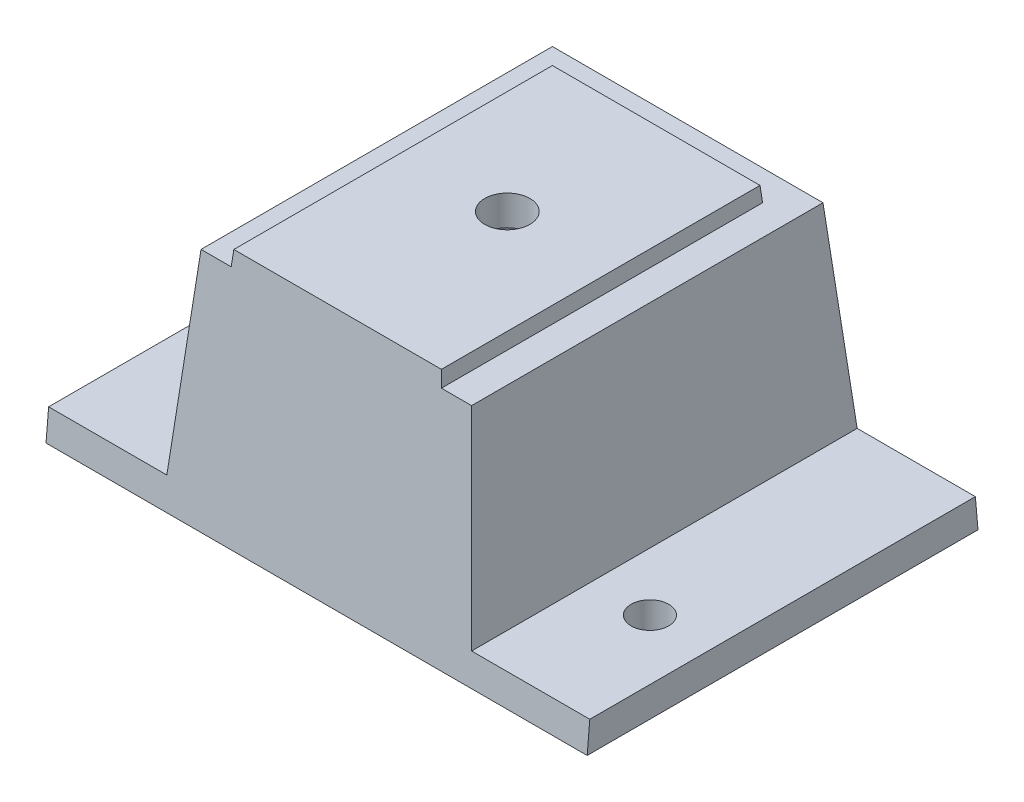
ISO-10303-21;
HEADER;
FILE_DESCRIPTION(('STEP AP214'),'2;1');
FILE_NAME('part.step','',(''),(''),'','','');
FILE_SCHEMA(('AUTOMOTIVE_DESIGN { 1 0 10303 214 1 1 1 1 }'));
ENDSEC;
DATA;
#1=APPLICATION_CONTEXT('core data for automotive mechanical design processes');
#2=APPLICATION_PROTOCOL_DEFINITION('international standard','automotive_design',2000,#1);
#3=PRODUCT_CONTEXT('',#1,'mechanical');
#4=PRODUCT('Part','Part','',(#3));
#5=PRODUCT_RELATED_PRODUCT_CATEGORY('part','',(#4));
#6=PRODUCT_DEFINITION_FORMATION('','',#4);
#7=PRODUCT_DEFINITION_CONTEXT('part definition',#1,'design');
#8=PRODUCT_DEFINITION('design','',#6,#7);
#9=PRODUCT_DEFINITION_SHAPE('','',#8);
#10=(LENGTH_UNIT() NAMED_UNIT(*) SI_UNIT(.MILLI.,.METRE.));
#11=(NAMED_UNIT(*) PLANE_ANGLE_UNIT() SI_UNIT($,.RADIAN.));
#12=(NAMED_UNIT(*) SI_UNIT($,.STERADIAN.) SOLID_ANGLE_UNIT());
#13=UNCERTAINTY_MEASURE_WITH_UNIT(LENGTH_MEASURE(1.E-05),#10,'distance_accuracy_value','');
#14=(GEOMETRIC_REPRESENTATION_CONTEXT(3) GLOBAL_UNCERTAINTY_ASSIGNED_CONTEXT((#13)) GLOBAL_UNIT_ASSIGNED_CONTEXT((#10,
#11,#12)) REPRESENTATION_CONTEXT('',''));
#15=CARTESIAN_POINT('',(0.,0.,0.));
#16=DIRECTION('',(0.,0.,1.));
#17=DIRECTION('',(1.,0.,0.));
#18=AXIS2_PLACEMENT_3D('',#15,#16,#17);
#19=CARTESIAN_POINT('',(57.15,0.,82.55));
#20=DIRECTION('',(0.,1.,0.));
#21=DIRECTION('',(0.,0.,1.));
#22=AXIS2_PLACEMENT_3D('',#19,#20,#21);
#23=PLANE('',#22);
#24=CARTESIAN_POINT('',(44.45,0.,56.5944469866104));
#25=DIRECTION('',(0.,1.,0.));
#26=DIRECTION('',(0.,0.,1.));
#27=AXIS2_PLACEMENT_3D('',#24,#25,#26);
#28=CIRCLE('',#27,3.96875);
#29=CARTESIAN_POINT('',(44.45,0.,60.5631969866104));
#30=VERTEX_POINT('',#29);
#31=EDGE_CURVE('E483',#30,#30,#28,.T.);
#32=ORIENTED_EDGE('',*,*,#31,.T.);
#33=EDGE_LOOP('',(#32));
#34=FACE_BOUND('',#33,.T.);
#35=CARTESIAN_POINT('',(-44.45,0.,56.5944469866104));
#36=DIRECTION('',(0.,1.,0.));
#37=DIRECTION('',(0.,0.,-1.));
#38=AXIS2_PLACEMENT_3D('',#35,#36,#37);
#39=CIRCLE('',#38,3.96875);
#40=CARTESIAN_POINT('',(-44.45,0.,60.5631969866104));
#41=VERTEX_POINT('',#40);
#42=EDGE_CURVE('E233',#41,#41,#39,.T.);
#43=ORIENTED_EDGE('',*,*,#42,.T.);
#44=EDGE_LOOP('',(#43));
#45=FACE_BOUND('',#44,.T.);
#46=DIRECTION('',(1.,0.,0.));
#47=VECTOR('',#46,1.);
#48=CARTESIAN_POINT('',(57.15,0.,0.));
#49=LINE('',#48,#47);
#50=CARTESIAN_POINT('',(-57.15,0.,0.));
#51=VERTEX_POINT('',#50);
#52=CARTESIAN_POINT('',(57.15,0.,0.));
#53=VERTEX_POINT('',#52);
#54=EDGE_CURVE('E182',#51,#53,#49,.T.);
#55=ORIENTED_EDGE('',*,*,#54,.T.);
#56=DIRECTION('',(0.,0.,-1.));
#57=VECTOR('',#56,1.);
#58=CARTESIAN_POINT('',(57.15,0.,82.55));
#59=LINE('',#58,#57);
#60=CARTESIAN_POINT('',(57.15,0.,82.55));
#61=VERTEX_POINT('',#60);
#62=EDGE_CURVE('E181',#61,#53,#59,.T.);
#63=ORIENTED_EDGE('',*,*,#62,.F.);
#64=DIRECTION('',(1.,0.,0.));
#65=VECTOR('',#64,1.);
#66=CARTESIAN_POINT('',(57.15,0.,82.55));
#67=LINE('',#66,#65);
#68=CARTESIAN_POINT('',(-57.15,0.,82.55));
#69=VERTEX_POINT('',#68);
#70=EDGE_CURVE('E173',#69,#61,#67,.T.);
#71=ORIENTED_EDGE('',*,*,#70,.F.);
#72=DIRECTION('',(0.,0.,-1.));
#73=VECTOR('',#72,1.);
#74=CARTESIAN_POINT('',(-57.15,0.,82.55));
#75=LINE('',#74,#73);
#76=EDGE_CURVE('E193',#69,#51,#75,.T.);
#77=ORIENTED_EDGE('',*,*,#76,.T.);
#78=EDGE_LOOP('',(#55,#63,#71,#77));
#79=FACE_BOUND('',#78,.T.);
#80=DIRECTION('',(0.,0.,-1.));
#81=VECTOR('',#80,1.);
#82=CARTESIAN_POINT('',(-26.3673916320217,0.,82.55));
#83=LINE('',#82,#81);
#84=CARTESIAN_POINT('',(-26.3673916320217,0.,76.2));
#85=VERTEX_POINT('',#84);
#86=CARTESIAN_POINT('',(-26.3673916320217,0.,6.35));
#87=VERTEX_POINT('',#86);
#88=EDGE_CURVE('E331',#85,#87,#83,.T.);
#89=ORIENTED_EDGE('',*,*,#88,.F.);
#90=DIRECTION('',(1.,0.,0.));
#91=VECTOR('',#90,1.);
#92=CARTESIAN_POINT('',(57.15,0.,76.2));
#93=LINE('',#92,#91);
#94=CARTESIAN_POINT('',(26.3673916320217,0.,76.2));
#95=VERTEX_POINT('',#94);
#96=EDGE_CURVE('E337',#85,#95,#93,.T.);
#97=ORIENTED_EDGE('',*,*,#96,.T.);
#98=DIRECTION('',(0.,0.,-1.));
#99=VECTOR('',#98,1.);
#100=CARTESIAN_POINT('',(26.3673916320217,0.,82.55));
#101=LINE('',#100,#99);
#102=CARTESIAN_POINT('',(26.3673916320217,0.,6.35));
#103=VERTEX_POINT('',#102);
#104=EDGE_CURVE('E287',#95,#103,#101,.T.);
#105=ORIENTED_EDGE('',*,*,#104,.T.);
#106=DIRECTION('',(1.,0.,0.));
#107=VECTOR('',#106,1.);
#108=CARTESIAN_POINT('',(57.15,0.,6.34999999999999));
#109=LINE('',#108,#107);
#110=EDGE_CURVE('E298',#87,#103,#109,.T.);
#111=ORIENTED_EDGE('',*,*,#110,.F.);
#112=EDGE_LOOP('',(#89,#97,#105,#111));
#113=FACE_BOUND('',#112,.T.);
#114=ADVANCED_FACE('F37',(#34,#45,#79,#113),#23,.F.);
#115=CARTESIAN_POINT('',(57.15,0.,82.55));
#116=DIRECTION('',(-1.,0.,0.));
#117=DIRECTION('',(0.,0.,1.));
#118=AXIS2_PLACEMENT_3D('',#115,#116,#117);
#119=PLANE('',#118);
#120=DIRECTION('',(0.,0.,-1.));
#121=VECTOR('',#120,1.);
#122=CARTESIAN_POINT('',(57.15,6.34999999999999,82.55));
#123=LINE('',#122,#121);
#124=CARTESIAN_POINT('',(57.15,6.34999999999999,81.9944469866104));
#125=VERTEX_POINT('',#124);
#126=CARTESIAN_POINT('',(57.15,6.34999999999999,0.555553013389595));
#127=VERTEX_POINT('',#126);
#128=EDGE_CURVE('E11',#125,#127,#123,.T.);
#129=ORIENTED_EDGE('',*,*,#128,.F.);
#130=DIRECTION('',(0.,-0.996194698091746,0.087155742747655));
#131=VECTOR('',#130,1.);
#132=CARTESIAN_POINT('',(57.15,0.,82.55));
#133=LINE('',#132,#131);
#134=EDGE_CURVE('E176',#125,#61,#133,.T.);
#135=ORIENTED_EDGE('',*,*,#134,.T.);
#136=ORIENTED_EDGE('',*,*,#62,.T.);
#137=DIRECTION('',(0.,0.996194698091746,0.087155742747655));
#138=VECTOR('',#137,1.);
#139=CARTESIAN_POINT('',(57.15,7.16732853320229,0.627059994421073));
#140=LINE('',#139,#138);
#141=EDGE_CURVE('E284',#53,#127,#140,.T.);
#142=ORIENTED_EDGE('',*,*,#141,.T.);
#143=EDGE_LOOP('',(#129,#135,#136,#142));
#144=FACE_BOUND('',#143,.T.);
#145=ADVANCED_FACE('F39',(#144),#119,.F.);
#146=CARTESIAN_POINT('',(57.15,6.34999999999999,82.55));
#147=DIRECTION('',(0.,-1.,0.));
#148=DIRECTION('',(1.,0.,0.));
#149=AXIS2_PLACEMENT_3D('',#146,#147,#148);
#150=PLANE('',#149);
#151=CARTESIAN_POINT('',(44.45,6.34999999999999,56.5944469866104));
#152=DIRECTION('',(0.,-1.,0.));
#153=DIRECTION('',(1.,0.,0.));
#154=AXIS2_PLACEMENT_3D('',#151,#152,#153);
#155=CIRCLE('',#154,3.96875);
#156=CARTESIAN_POINT('',(44.45,6.34999999999999,60.5631969866104));
#157=VERTEX_POINT('',#156);
#158=EDGE_CURVE('E41',#157,#157,#155,.T.);
#159=ORIENTED_EDGE('',*,*,#158,.T.);
#160=EDGE_LOOP('',(#159));
#161=FACE_BOUND('',#160,.T.);
#162=DIRECTION('',(0.,0.,-1.));
#163=VECTOR('',#162,1.);
#164=CARTESIAN_POINT('',(32.1860945870324,6.34999999999999,82.55));
#165=LINE('',#164,#163);
#166=CARTESIAN_POINT('',(32.1860945870324,6.34999999999999,81.9944469866104));
#167=VERTEX_POINT('',#166);
#168=CARTESIAN_POINT('',(32.1860945870324,6.34999999999999,0.555553013389599));
#169=VERTEX_POINT('',#168);
#170=EDGE_CURVE('E46',#167,#169,#165,.T.);
#171=ORIENTED_EDGE('',*,*,#170,.F.);
#172=DIRECTION('',(1.,0.,0.));
#173=VECTOR('',#172,1.);
#174=CARTESIAN_POINT('',(57.15,6.34999999999999,81.9944469866104));
#175=LINE('',#174,#173);
#176=EDGE_CURVE('E252',#167,#125,#175,.T.);
#177=ORIENTED_EDGE('',*,*,#176,.T.);
#178=ORIENTED_EDGE('',*,*,#128,.T.);
#179=DIRECTION('',(-1.,0.,0.));
#180=VECTOR('',#179,1.);
#181=CARTESIAN_POINT('',(57.15,6.34999999999999,0.555553013389595));
#182=LINE('',#181,#180);
#183=EDGE_CURVE('E281',#127,#169,#182,.T.);
#184=ORIENTED_EDGE('',*,*,#183,.T.);
#185=EDGE_LOOP('',(#171,#177,#178,#184));
#186=FACE_BOUND('',#185,.T.);
#187=ADVANCED_FACE('F394',(#161,#186),#150,.F.);
#188=CARTESIAN_POINT('',(32.1860945870324,6.34999999999999,82.55));
#189=DIRECTION('',(-0.996194698091746,-0.0871557427476546,0.));
#190=DIRECTION('',(0.0871557427476546,-0.996194698091746,0.));
#191=AXIS2_PLACEMENT_3D('',#188,#189,#190);
#192=PLANE('',#191);
#193=DIRECTION('',(0.,0.,-1.));
#194=VECTOR('',#193,1.);
#195=CARTESIAN_POINT('',(28.575,47.625,82.55));
#196=LINE('',#195,#194);
#197=CARTESIAN_POINT('',(28.575,47.625,78.383352399578));
#198=VERTEX_POINT('',#197);
#199=CARTESIAN_POINT('',(28.575,47.625,4.16664760042197));
#200=VERTEX_POINT('',#199);
#201=EDGE_CURVE('E212',#198,#200,#196,.T.);
#202=ORIENTED_EDGE('',*,*,#201,.F.);
#203=DIRECTION('',(0.086826593864244,-0.992432509138968,0.0868265938642445));
#204=VECTOR('',#203,1.);
#205=CARTESIAN_POINT('',(32.1902828219796,6.30212825549686,81.9986352215576));
#206=LINE('',#205,#204);
#207=EDGE_CURVE('E249',#198,#167,#206,.T.);
#208=ORIENTED_EDGE('',*,*,#207,.T.);
#209=ORIENTED_EDGE('',*,*,#170,.T.);
#210=DIRECTION('',(-0.086826593864244,0.992432509138968,0.0868265938642445));
#211=VECTOR('',#210,1.);
#212=CARTESIAN_POINT('',(31.567950143439,13.4154233209336,1.17369745698295));
#213=LINE('',#212,#211);
#214=EDGE_CURVE('E278',#169,#200,#213,.T.);
#215=ORIENTED_EDGE('',*,*,#214,.T.);
#216=EDGE_LOOP('',(#202,#208,#209,#215));
#217=FACE_BOUND('',#216,.T.);
#218=ADVANCED_FACE('F424',(#217),#192,.F.);
#219=CARTESIAN_POINT('',(21.9229675249049,50.8,82.55));
#220=DIRECTION('',(-0.996194698091746,-0.0871557427476559,0.));
#221=DIRECTION('',(0.0871557427476559,-0.996194698091746,0.));
#222=AXIS2_PLACEMENT_3D('',#219,#220,#221);
#223=PLANE('',#222);
#224=DIRECTION('',(0.,0.,-1.));
#225=VECTOR('',#224,1.);
#226=CARTESIAN_POINT('',(21.9229675249049,50.8,82.55));
#227=LINE('',#226,#225);
#228=CARTESIAN_POINT('',(21.9229675249049,50.8,78.1055758928832));
#229=VERTEX_POINT('',#228);
#230=CARTESIAN_POINT('',(21.9229675249049,50.8,10.818680075517));
#231=VERTEX_POINT('',#230);
#232=EDGE_CURVE('E208',#229,#231,#227,.T.);
#233=ORIENTED_EDGE('',*,*,#232,.F.);
#234=DIRECTION('',(0.0868265938642453,-0.992432509138968,0.0868265938642445));
#235=VECTOR('',#234,1.);
#236=CARTESIAN_POINT('',(21.9564734044828,50.417026043975,78.1390817724611));
#237=LINE('',#236,#235);
#238=CARTESIAN_POINT('',(22.2007440315997,47.625,78.383352399578));
#239=VERTEX_POINT('',#238);
#240=EDGE_CURVE('E189',#229,#239,#237,.T.);
#241=ORIENTED_EDGE('',*,*,#240,.T.);
#242=DIRECTION('',(0.,0.,-1.));
#243=VECTOR('',#242,1.);
#244=CARTESIAN_POINT('',(22.2007440315997,47.625,82.55));
#245=LINE('',#244,#243);
#246=CARTESIAN_POINT('',(22.2007440315997,47.625,10.5409035688222));
#247=VERTEX_POINT('',#246);
#248=EDGE_CURVE('E210',#239,#247,#245,.T.);
#249=ORIENTED_EDGE('',*,*,#248,.T.);
#250=DIRECTION('',(-0.0868265938642453,0.992432509138967,0.0868265938642458));
#251=VECTOR('',#250,1.);
#252=CARTESIAN_POINT('',(21.3821953327322,56.981054440413,11.3594522676897));
#253=LINE('',#252,#251);
#254=EDGE_CURVE('E263',#247,#231,#253,.T.);
#255=ORIENTED_EDGE('',*,*,#254,.T.);
#256=EDGE_LOOP('',(#233,#241,#249,#255));
#257=FACE_BOUND('',#256,.T.);
#258=ADVANCED_FACE('F420',(#257),#223,.F.);
#259=CARTESIAN_POINT('',(-21.922967524905,50.8,82.55));
#260=DIRECTION('',(0.,-1.,0.));
#261=DIRECTION('',(0.,0.,-1.));
#262=AXIS2_PLACEMENT_3D('',#259,#260,#261);
#263=PLANE('',#262);
#264=CARTESIAN_POINT('',(0.,50.8,42.266647600422));
#265=DIRECTION('',(0.,1.,0.));
#266=DIRECTION('',(0.,0.,1.));
#267=AXIS2_PLACEMENT_3D('',#264,#265,#266);
#268=CIRCLE('',#267,4.7625);
#269=CARTESIAN_POINT('',(0.,50.8,47.029147600422));
#270=VERTEX_POINT('',#269);
#271=EDGE_CURVE('E218',#270,#270,#268,.T.);
#272=ORIENTED_EDGE('',*,*,#271,.F.);
#273=EDGE_LOOP('',(#272));
#274=FACE_BOUND('',#273,.T.);
#275=DIRECTION('',(0.,0.,-1.));
#276=VECTOR('',#275,1.);
#277=CARTESIAN_POINT('',(-21.922967524905,50.8,82.55));
#278=LINE('',#277,#276);
#279=CARTESIAN_POINT('',(-21.922967524905,50.8,78.1055758928832));
#280=VERTEX_POINT('',#279);
#281=CARTESIAN_POINT('',(-21.922967524905,50.8,10.818680075517));
#282=VERTEX_POINT('',#281);
#283=EDGE_CURVE('E206',#280,#282,#278,.T.);
#284=ORIENTED_EDGE('',*,*,#283,.F.);
#285=DIRECTION('',(1.,0.,0.));
#286=VECTOR('',#285,1.);
#287=CARTESIAN_POINT('',(-21.922967524905,50.8,78.1055758928832));
#288=LINE('',#287,#286);
#289=EDGE_CURVE('E244',#280,#229,#288,.T.);
#290=ORIENTED_EDGE('',*,*,#289,.T.);
#291=ORIENTED_EDGE('',*,*,#232,.T.);
#292=DIRECTION('',(1.,0.,0.));
#293=VECTOR('',#292,1.);
#294=CARTESIAN_POINT('',(-57.15,50.8,10.818680075517));
#295=LINE('',#294,#293);
#296=EDGE_CURVE('E254',#282,#231,#295,.T.);
#297=ORIENTED_EDGE('',*,*,#296,.F.);
#298=EDGE_LOOP('',(#284,#290,#291,#297));
#299=FACE_BOUND('',#298,.T.);
#300=ADVANCED_FACE('F416',(#274,#299),#263,.F.);
#301=CARTESIAN_POINT('',(-22.2007440315997,47.625,82.55));
#302=DIRECTION('',(0.996194698091746,-0.0871557427476537,0.));
#303=DIRECTION('',(0.0871557427476537,0.996194698091746,0.));
#304=AXIS2_PLACEMENT_3D('',#301,#302,#303);
#305=PLANE('',#304);
#306=DIRECTION('',(0.,0.,-1.));
#307=VECTOR('',#306,1.);
#308=CARTESIAN_POINT('',(-22.2007440315997,47.625,82.55));
#309=LINE('',#308,#307);
#310=CARTESIAN_POINT('',(-22.2007440315997,47.625,78.383352399578));
#311=VERTEX_POINT('',#310);
#312=CARTESIAN_POINT('',(-22.2007440315997,47.625,10.5409035688222));
#313=VERTEX_POINT('',#312);
#314=EDGE_CURVE('E204',#311,#313,#309,.T.);
#315=ORIENTED_EDGE('',*,*,#314,.F.);
#316=DIRECTION('',(0.0868265938642432,0.992432509138968,-0.0868265938642445));
#317=VECTOR('',#316,1.);
#318=CARTESIAN_POINT('',(-22.232155793704,47.2659619162266,78.4147641616823));
#319=LINE('',#318,#317);
#320=EDGE_CURVE('E241',#311,#280,#319,.T.);
#321=ORIENTED_EDGE('',*,*,#320,.T.);
#322=ORIENTED_EDGE('',*,*,#283,.T.);
#323=DIRECTION('',(-0.0868265938642432,-0.992432509138968,-0.0868265938642459));
#324=VECTOR('',#323,1.);
#325=CARTESIAN_POINT('',(-21.6578777219534,53.8299903126646,11.0837698784686));
#326=LINE('',#325,#324);
#327=EDGE_CURVE('E258',#282,#313,#326,.T.);
#328=ORIENTED_EDGE('',*,*,#327,.T.);
#329=EDGE_LOOP('',(#315,#321,#322,#328));
#330=FACE_BOUND('',#329,.T.);
#331=ADVANCED_FACE('F412',(#330),#305,.F.);
#332=CARTESIAN_POINT('',(-28.575,47.625,82.55));
#333=DIRECTION('',(0.,-1.,0.));
#334=DIRECTION('',(0.,0.,-1.));
#335=AXIS2_PLACEMENT_3D('',#332,#333,#334);
#336=PLANE('',#335);
#337=DIRECTION('',(0.,0.,-1.));
#338=VECTOR('',#337,1.);
#339=CARTESIAN_POINT('',(-28.575,47.625,82.55));
#340=LINE('',#339,#338);
#341=CARTESIAN_POINT('',(-28.575,47.625,78.383352399578));
#342=VERTEX_POINT('',#341);
#343=CARTESIAN_POINT('',(-28.575,47.625,4.16664760042198));
#344=VERTEX_POINT('',#343);
#345=EDGE_CURVE('E202',#342,#344,#340,.T.);
#346=ORIENTED_EDGE('',*,*,#345,.F.);
#347=DIRECTION('',(1.,0.,0.));
#348=VECTOR('',#347,1.);
#349=CARTESIAN_POINT('',(-28.575,47.625,78.383352399578));
#350=LINE('',#349,#348);
#351=EDGE_CURVE('E238',#342,#311,#350,.T.);
#352=ORIENTED_EDGE('',*,*,#351,.T.);
#353=ORIENTED_EDGE('',*,*,#314,.T.);
#354=DIRECTION('',(1.,0.,0.));
#355=VECTOR('',#354,1.);
#356=CARTESIAN_POINT('',(-57.15,47.625,10.5409035688222));
#357=LINE('',#356,#355);
#358=EDGE_CURVE('E255',#313,#247,#357,.T.);
#359=ORIENTED_EDGE('',*,*,#358,.T.);
#360=ORIENTED_EDGE('',*,*,#248,.F.);
#361=EDGE_CURVE('E188',#239,#198,#350,.T.);
#362=ORIENTED_EDGE('',*,*,#361,.T.);
#363=ORIENTED_EDGE('',*,*,#201,.T.);
#364=DIRECTION('',(-1.,0.,0.));
#365=VECTOR('',#364,1.);
#366=CARTESIAN_POINT('',(22.2007440315997,47.625,4.16664760042197));
#367=LINE('',#366,#365);
#368=EDGE_CURVE('E275',#200,#344,#367,.T.);
#369=ORIENTED_EDGE('',*,*,#368,.T.);
#370=EDGE_LOOP('',(#346,#352,#353,#359,#360,#362,#363,#369));
#371=FACE_BOUND('',#370,.T.);
#372=ADVANCED_FACE('F408',(#371),#336,.F.);
#373=CARTESIAN_POINT('',(-32.1860945870324,6.34999999999999,82.55));
#374=DIRECTION('',(0.996194698091746,-0.0871557427476543,0.));
#375=DIRECTION('',(0.0871557427476543,0.996194698091746,0.));
#376=AXIS2_PLACEMENT_3D('',#373,#374,#375);
#377=PLANE('',#376);
#378=DIRECTION('',(0.,0.,-1.));
#379=VECTOR('',#378,1.);
#380=CARTESIAN_POINT('',(-32.1860945870324,6.34999999999999,82.55));
#381=LINE('',#380,#379);
#382=CARTESIAN_POINT('',(-32.1860945870324,6.34999999999999,81.9944469866104));
#383=VERTEX_POINT('',#382);
#384=CARTESIAN_POINT('',(-32.1860945870324,6.34999999999999,0.555553013389595));
#385=VERTEX_POINT('',#384);
#386=EDGE_CURVE('E200',#383,#385,#381,.T.);
#387=ORIENTED_EDGE('',*,*,#386,.F.);
#388=DIRECTION('',(0.0868265938642437,0.992432509138968,-0.0868265938642445));
#389=VECTOR('',#388,1.);
#390=CARTESIAN_POINT('',(-32.1902828219796,6.30212825549686,81.9986352215576));
#391=LINE('',#390,#389);
#392=EDGE_CURVE('E230',#383,#342,#391,.T.);
#393=ORIENTED_EDGE('',*,*,#392,.T.);
#394=ORIENTED_EDGE('',*,*,#345,.T.);
#395=DIRECTION('',(-0.0868265938642437,-0.992432509138968,-0.0868265938642445));
#396=VECTOR('',#395,1.);
#397=CARTESIAN_POINT('',(-31.567950143439,13.4154233209336,1.17369745698295));
#398=LINE('',#397,#396);
#399=EDGE_CURVE('E272',#344,#385,#398,.T.);
#400=ORIENTED_EDGE('',*,*,#399,.T.);
#401=EDGE_LOOP('',(#387,#393,#394,#400));
#402=FACE_BOUND('',#401,.T.);
#403=ADVANCED_FACE('F405',(#402),#377,.F.);
#404=CARTESIAN_POINT('',(-57.15,6.34999999999999,82.55));
#405=DIRECTION('',(0.,-1.,0.));
#406=DIRECTION('',(1.,0.,0.));
#407=AXIS2_PLACEMENT_3D('',#404,#405,#406);
#408=PLANE('',#407);
#409=CARTESIAN_POINT('',(-44.45,6.34999999999999,56.5944469866104));
#410=DIRECTION('',(0.,-1.,0.));
#411=DIRECTION('',(1.,0.,0.));
#412=AXIS2_PLACEMENT_3D('',#409,#410,#411);
#413=CIRCLE('',#412,3.96875);
#414=CARTESIAN_POINT('',(-44.45,6.34999999999999,60.5631969866104));
#415=VERTEX_POINT('',#414);
#416=EDGE_CURVE('E217',#415,#415,#413,.T.);
#417=ORIENTED_EDGE('',*,*,#416,.T.);
#418=EDGE_LOOP('',(#417));
#419=FACE_BOUND('',#418,.T.);
#420=DIRECTION('',(0.,0.,-1.));
#421=VECTOR('',#420,1.);
#422=CARTESIAN_POINT('',(-57.15,6.34999999999999,82.55));
#423=LINE('',#422,#421);
#424=CARTESIAN_POINT('',(-57.15,6.34999999999999,81.9944469866104));
#425=VERTEX_POINT('',#424);
#426=CARTESIAN_POINT('',(-57.15,6.34999999999999,0.555553013389603));
#427=VERTEX_POINT('',#426);
#428=EDGE_CURVE('E195',#425,#427,#423,.T.);
#429=ORIENTED_EDGE('',*,*,#428,.F.);
#430=DIRECTION('',(1.,0.,0.));
#431=VECTOR('',#430,1.);
#432=CARTESIAN_POINT('',(-57.15,6.34999999999999,81.9944469866104));
#433=LINE('',#432,#431);
#434=EDGE_CURVE('E225',#425,#383,#433,.T.);
#435=ORIENTED_EDGE('',*,*,#434,.T.);
#436=ORIENTED_EDGE('',*,*,#386,.T.);
#437=DIRECTION('',(-1.,0.,0.));
#438=VECTOR('',#437,1.);
#439=CARTESIAN_POINT('',(-57.15,6.34999999999999,0.555553013389595));
#440=LINE('',#439,#438);
#441=EDGE_CURVE('E269',#385,#427,#440,.T.);
#442=ORIENTED_EDGE('',*,*,#441,.T.);
#443=EDGE_LOOP('',(#429,#435,#436,#442));
#444=FACE_BOUND('',#443,.T.);
#445=ADVANCED_FACE('F402',(#419,#444),#408,.F.);
#446=CARTESIAN_POINT('',(-57.15,0.,82.55));
#447=DIRECTION('',(1.,0.,0.));
#448=DIRECTION('',(0.,0.,-1.));
#449=AXIS2_PLACEMENT_3D('',#446,#447,#448);
#450=PLANE('',#449);
#451=ORIENTED_EDGE('',*,*,#76,.F.);
#452=DIRECTION('',(0.,0.996194698091746,-0.087155742747655));
#453=VECTOR('',#452,1.);
#454=CARTESIAN_POINT('',(-57.15,0.,82.55));
#455=LINE('',#454,#453);
#456=EDGE_CURVE('E63',#69,#425,#455,.T.);
#457=ORIENTED_EDGE('',*,*,#456,.T.);
#458=ORIENTED_EDGE('',*,*,#428,.T.);
#459=DIRECTION('',(0.,-0.996194698091746,-0.087155742747655));
#460=VECTOR('',#459,1.);
#461=CARTESIAN_POINT('',(-57.15,7.16732853320229,0.627059994421073));
#462=LINE('',#461,#460);
#463=EDGE_CURVE('E266',#427,#51,#462,.T.);
#464=ORIENTED_EDGE('',*,*,#463,.T.);
#465=EDGE_LOOP('',(#451,#457,#458,#464));
#466=FACE_BOUND('',#465,.T.);
#467=ADVANCED_FACE('F386',(#466),#450,.F.);
#468=CARTESIAN_POINT('',(25.8602582541498,5.79656103355238,82.55));
#469=DIRECTION('',(-0.996194698091746,-0.0871557427476546,0.));
#470=DIRECTION('',(0.0871557427476546,-0.996194698091746,0.));
#471=AXIS2_PLACEMENT_3D('',#468,#469,#470);
#472=PLANE('',#471);
#473=DIRECTION('',(-0.0871557427476546,0.996194698091746,0.));
#474=VECTOR('',#473,1.);
#475=CARTESIAN_POINT('',(25.8602582541498,5.79656103355238,6.34999999999999));
#476=LINE('',#475,#474);
#477=CARTESIAN_POINT('',(22.7562970449893,41.275,6.35));
#478=VERTEX_POINT('',#477);
#479=EDGE_CURVE('E286',#103,#478,#476,.T.);
#480=ORIENTED_EDGE('',*,*,#479,.F.);
#481=ORIENTED_EDGE('',*,*,#104,.F.);
#482=DIRECTION('',(-0.0871557427476546,0.996194698091746,0.));
#483=VECTOR('',#482,1.);
#484=CARTESIAN_POINT('',(25.8602582541498,5.79656103355238,76.2));
#485=LINE('',#484,#483);
#486=CARTESIAN_POINT('',(22.7562970449893,41.275,76.2));
#487=VERTEX_POINT('',#486);
#488=EDGE_CURVE('E54',#95,#487,#485,.T.);
#489=ORIENTED_EDGE('',*,*,#488,.T.);
#490=DIRECTION('',(0.,0.,-1.));
#491=VECTOR('',#490,1.);
#492=CARTESIAN_POINT('',(22.7562970449893,41.275,82.55));
#493=LINE('',#492,#491);
#494=EDGE_CURVE('E290',#487,#478,#493,.T.);
#495=ORIENTED_EDGE('',*,*,#494,.T.);
#496=EDGE_LOOP('',(#480,#481,#489,#495));
#497=FACE_BOUND('',#496,.T.);
#498=ADVANCED_FACE('F349',(#497),#472,.T.);
#499=CARTESIAN_POINT('',(22.2007440315997,41.275,82.55));
#500=DIRECTION('',(0.,-1.,0.));
#501=DIRECTION('',(0.,0.,-1.));
#502=AXIS2_PLACEMENT_3D('',#499,#500,#501);
#503=PLANE('',#502);
#504=DIRECTION('',(-1.,0.,0.));
#505=VECTOR('',#504,1.);
#506=CARTESIAN_POINT('',(22.2007440315997,41.275,6.34999999999999));
#507=LINE('',#506,#505);
#508=CARTESIAN_POINT('',(16.3820410765891,41.275,6.35));
#509=VERTEX_POINT('',#508);
#510=EDGE_CURVE('E292',#478,#509,#507,.T.);
#511=ORIENTED_EDGE('',*,*,#510,.F.);
#512=ORIENTED_EDGE('',*,*,#494,.F.);
#513=DIRECTION('',(-1.,0.,0.));
#514=VECTOR('',#513,1.);
#515=CARTESIAN_POINT('',(22.2007440315997,41.275,76.2));
#516=LINE('',#515,#514);
#517=CARTESIAN_POINT('',(16.3820410765891,41.275,76.2));
#518=VERTEX_POINT('',#517);
#519=EDGE_CURVE('E297',#487,#518,#516,.T.);
#520=ORIENTED_EDGE('',*,*,#519,.T.);
#521=DIRECTION('',(0.,0.,-1.));
#522=VECTOR('',#521,1.);
#523=CARTESIAN_POINT('',(16.3820410765891,41.275,82.55));
#524=LINE('',#523,#522);
#525=EDGE_CURVE('E295',#518,#509,#524,.T.);
#526=ORIENTED_EDGE('',*,*,#525,.T.);
#527=EDGE_LOOP('',(#511,#512,#520,#526));
#528=FACE_BOUND('',#527,.T.);
#529=ADVANCED_FACE('F378',(#528),#503,.T.);
#530=CARTESIAN_POINT('',(15.5971311920224,50.2465610335524,82.55));
#531=DIRECTION('',(-0.996194698091746,-0.0871557427476559,0.));
#532=DIRECTION('',(0.0871557427476559,-0.996194698091746,0.));
#533=AXIS2_PLACEMENT_3D('',#530,#531,#532);
#534=PLANE('',#533);
#535=DIRECTION('',(-0.0871557427476559,0.996194698091746,0.));
#536=VECTOR('',#535,1.);
#537=CARTESIAN_POINT('',(15.5971311920224,50.2465610335524,6.34999999999999));
#538=LINE('',#537,#536);
#539=CARTESIAN_POINT('',(16.1042645698943,44.45,6.35));
#540=VERTEX_POINT('',#539);
#541=EDGE_CURVE('E300',#509,#540,#538,.T.);
#542=ORIENTED_EDGE('',*,*,#541,.F.);
#543=ORIENTED_EDGE('',*,*,#525,.F.);
#544=DIRECTION('',(-0.0871557427476559,0.996194698091746,0.));
#545=VECTOR('',#544,1.);
#546=CARTESIAN_POINT('',(15.5971311920224,50.2465610335524,76.2));
#547=LINE('',#546,#545);
#548=CARTESIAN_POINT('',(16.1042645698943,44.45,76.2));
#549=VERTEX_POINT('',#548);
#550=EDGE_CURVE('E305',#518,#549,#547,.T.);
#551=ORIENTED_EDGE('',*,*,#550,.T.);
#552=DIRECTION('',(0.,0.,-1.));
#553=VECTOR('',#552,1.);
#554=CARTESIAN_POINT('',(16.1042645698943,44.45,82.55));
#555=LINE('',#554,#553);
#556=EDGE_CURVE('E303',#549,#540,#555,.T.);
#557=ORIENTED_EDGE('',*,*,#556,.T.);
#558=EDGE_LOOP('',(#542,#543,#551,#557));
#559=FACE_BOUND('',#558,.T.);
#560=ADVANCED_FACE('F375',(#559),#534,.T.);
#561=CARTESIAN_POINT('',(-21.922967524905,44.45,82.55));
#562=DIRECTION('',(0.,-1.,0.));
#563=DIRECTION('',(0.,0.,-1.));
#564=AXIS2_PLACEMENT_3D('',#561,#562,#563);
#565=PLANE('',#564);
#566=CARTESIAN_POINT('',(0.,44.45,42.266647600422));
#567=DIRECTION('',(0.,-1.,0.));
#568=DIRECTION('',(0.,0.,-1.));
#569=AXIS2_PLACEMENT_3D('',#566,#567,#568);
#570=CIRCLE('',#569,4.7625);
#571=CARTESIAN_POINT('',(0.,44.45,47.029147600422));
#572=VERTEX_POINT('',#571);
#573=EDGE_CURVE('E215',#572,#572,#570,.T.);
#574=ORIENTED_EDGE('',*,*,#573,.F.);
#575=EDGE_LOOP('',(#574));
#576=FACE_BOUND('',#575,.T.);
#577=DIRECTION('',(-1.,0.,0.));
#578=VECTOR('',#577,1.);
#579=CARTESIAN_POINT('',(-21.922967524905,44.45,6.34999999999999));
#580=LINE('',#579,#578);
#581=CARTESIAN_POINT('',(-16.1042645698943,44.45,6.35));
#582=VERTEX_POINT('',#581);
#583=EDGE_CURVE('E307',#540,#582,#580,.T.);
#584=ORIENTED_EDGE('',*,*,#583,.F.);
#585=ORIENTED_EDGE('',*,*,#556,.F.);
#586=DIRECTION('',(-1.,0.,0.));
#587=VECTOR('',#586,1.);
#588=CARTESIAN_POINT('',(-21.922967524905,44.45,76.2));
#589=LINE('',#588,#587);
#590=CARTESIAN_POINT('',(-16.1042645698943,44.45,76.2));
#591=VERTEX_POINT('',#590);
#592=EDGE_CURVE('E312',#549,#591,#589,.T.);
#593=ORIENTED_EDGE('',*,*,#592,.T.);
#594=DIRECTION('',(0.,0.,-1.));
#595=VECTOR('',#594,1.);
#596=CARTESIAN_POINT('',(-16.1042645698943,44.45,82.55));
#597=LINE('',#596,#595);
#598=EDGE_CURVE('E310',#591,#582,#597,.T.);
#599=ORIENTED_EDGE('',*,*,#598,.T.);
#600=EDGE_LOOP('',(#584,#585,#593,#599));
#601=FACE_BOUND('',#600,.T.);
#602=ADVANCED_FACE('F371',(#576,#601),#565,.T.);
#603=CARTESIAN_POINT('',(-15.8749076987172,47.0715610335524,82.55));
#604=DIRECTION('',(0.996194698091746,-0.0871557427476537,0.));
#605=DIRECTION('',(0.0871557427476537,0.996194698091746,0.));
#606=AXIS2_PLACEMENT_3D('',#603,#604,#605);
#607=PLANE('',#606);
#608=DIRECTION('',(-0.0871557427476537,-0.996194698091746,0.));
#609=VECTOR('',#608,1.);
#610=CARTESIAN_POINT('',(-15.8749076987172,47.0715610335524,6.34999999999999));
#611=LINE('',#610,#609);
#612=CARTESIAN_POINT('',(-16.3820410765891,41.275,6.35));
#613=VERTEX_POINT('',#612);
#614=EDGE_CURVE('E314',#582,#613,#611,.T.);
#615=ORIENTED_EDGE('',*,*,#614,.F.);
#616=ORIENTED_EDGE('',*,*,#598,.F.);
#617=DIRECTION('',(-0.0871557427476537,-0.996194698091746,0.));
#618=VECTOR('',#617,1.);
#619=CARTESIAN_POINT('',(-15.8749076987172,47.0715610335524,76.2));
#620=LINE('',#619,#618);
#621=CARTESIAN_POINT('',(-16.3820410765891,41.275,76.2));
#622=VERTEX_POINT('',#621);
#623=EDGE_CURVE('E319',#591,#622,#620,.T.);
#624=ORIENTED_EDGE('',*,*,#623,.T.);
#625=DIRECTION('',(0.,0.,-1.));
#626=VECTOR('',#625,1.);
#627=CARTESIAN_POINT('',(-16.3820410765891,41.275,82.55));
#628=LINE('',#627,#626);
#629=EDGE_CURVE('E317',#622,#613,#628,.T.);
#630=ORIENTED_EDGE('',*,*,#629,.T.);
#631=EDGE_LOOP('',(#615,#616,#624,#630));
#632=FACE_BOUND('',#631,.T.);
#633=ADVANCED_FACE('F368',(#632),#607,.T.);
#634=CARTESIAN_POINT('',(-28.575,41.275,82.55));
#635=DIRECTION('',(0.,-1.,0.));
#636=DIRECTION('',(0.,0.,-1.));
#637=AXIS2_PLACEMENT_3D('',#634,#635,#636);
#638=PLANE('',#637);
#639=DIRECTION('',(-1.,0.,0.));
#640=VECTOR('',#639,1.);
#641=CARTESIAN_POINT('',(-28.575,41.275,6.34999999999999));
#642=LINE('',#641,#640);
#643=CARTESIAN_POINT('',(-22.7562970449893,41.275,6.35));
#644=VERTEX_POINT('',#643);
#645=EDGE_CURVE('E321',#613,#644,#642,.T.);
#646=ORIENTED_EDGE('',*,*,#645,.F.);
#647=ORIENTED_EDGE('',*,*,#629,.F.);
#648=DIRECTION('',(-1.,0.,0.));
#649=VECTOR('',#648,1.);
#650=CARTESIAN_POINT('',(-28.575,41.275,76.2));
#651=LINE('',#650,#649);
#652=CARTESIAN_POINT('',(-22.7562970449893,41.275,76.2));
#653=VERTEX_POINT('',#652);
#654=EDGE_CURVE('E326',#622,#653,#651,.T.);
#655=ORIENTED_EDGE('',*,*,#654,.T.);
#656=DIRECTION('',(0.,0.,-1.));
#657=VECTOR('',#656,1.);
#658=CARTESIAN_POINT('',(-22.7562970449893,41.275,82.55));
#659=LINE('',#658,#657);
#660=EDGE_CURVE('E324',#653,#644,#659,.T.);
#661=ORIENTED_EDGE('',*,*,#660,.T.);
#662=EDGE_LOOP('',(#646,#647,#655,#661));
#663=FACE_BOUND('',#662,.T.);
#664=ADVANCED_FACE('F360',(#663),#638,.T.);
#665=CARTESIAN_POINT('',(-25.8602582541498,5.79656103355238,82.55));
#666=DIRECTION('',(0.996194698091746,-0.0871557427476543,0.));
#667=DIRECTION('',(0.0871557427476543,0.996194698091746,0.));
#668=AXIS2_PLACEMENT_3D('',#665,#666,#667);
#669=PLANE('',#668);
#670=DIRECTION('',(-0.0871557427476543,-0.996194698091746,0.));
#671=VECTOR('',#670,1.);
#672=CARTESIAN_POINT('',(-25.8602582541498,5.79656103355238,6.34999999999999));
#673=LINE('',#672,#671);
#674=EDGE_CURVE('E328',#644,#87,#673,.T.);
#675=ORIENTED_EDGE('',*,*,#674,.F.);
#676=ORIENTED_EDGE('',*,*,#660,.F.);
#677=DIRECTION('',(-0.0871557427476543,-0.996194698091746,0.));
#678=VECTOR('',#677,1.);
#679=CARTESIAN_POINT('',(-25.8602582541498,5.79656103355238,76.2));
#680=LINE('',#679,#678);
#681=EDGE_CURVE('E333',#653,#85,#680,.T.);
#682=ORIENTED_EDGE('',*,*,#681,.T.);
#683=ORIENTED_EDGE('',*,*,#88,.T.);
#684=EDGE_LOOP('',(#675,#676,#682,#683));
#685=FACE_BOUND('',#684,.T.);
#686=ADVANCED_FACE('F357',(#685),#669,.T.);
#687=CARTESIAN_POINT('',(0.,0.,76.2));
#688=DIRECTION('',(0.,0.,1.));
#689=DIRECTION('',(1.,0.,0.));
#690=AXIS2_PLACEMENT_3D('',#687,#688,#689);
#691=PLANE('',#690);
#692=ORIENTED_EDGE('',*,*,#681,.F.);
#693=ORIENTED_EDGE('',*,*,#654,.F.);
#694=ORIENTED_EDGE('',*,*,#623,.F.);
#695=ORIENTED_EDGE('',*,*,#592,.F.);
#696=ORIENTED_EDGE('',*,*,#550,.F.);
#697=ORIENTED_EDGE('',*,*,#519,.F.);
#698=ORIENTED_EDGE('',*,*,#488,.F.);
#699=ORIENTED_EDGE('',*,*,#96,.F.);
#700=EDGE_LOOP('',(#692,#693,#694,#695,#696,#697,#698,#699));
#701=FACE_BOUND('',#700,.T.);
#702=ADVANCED_FACE('F353',(#701),#691,.F.);
#703=CARTESIAN_POINT('',(0.,0.,6.35));
#704=DIRECTION('',(0.,0.,1.));
#705=DIRECTION('',(1.,0.,0.));
#706=AXIS2_PLACEMENT_3D('',#703,#704,#705);
#707=PLANE('',#706);
#708=ORIENTED_EDGE('',*,*,#479,.T.);
#709=ORIENTED_EDGE('',*,*,#510,.T.);
#710=ORIENTED_EDGE('',*,*,#541,.T.);
#711=ORIENTED_EDGE('',*,*,#583,.T.);
#712=ORIENTED_EDGE('',*,*,#614,.T.);
#713=ORIENTED_EDGE('',*,*,#645,.T.);
#714=ORIENTED_EDGE('',*,*,#674,.T.);
#715=ORIENTED_EDGE('',*,*,#110,.T.);
#716=EDGE_LOOP('',(#708,#709,#710,#711,#712,#713,#714,#715));
#717=FACE_BOUND('',#716,.T.);
#718=ADVANCED_FACE('F345',(#717),#707,.T.);
#719=CARTESIAN_POINT('',(0.,0.,0.));
#720=DIRECTION('',(0.,-0.087155742747655,0.996194698091746));
#721=DIRECTION('',(0.,-0.996194698091746,-0.087155742747655));
#722=AXIS2_PLACEMENT_3D('',#719,#720,#721);
#723=PLANE('',#722);
#724=ORIENTED_EDGE('',*,*,#399,.F.);
#725=ORIENTED_EDGE('',*,*,#368,.F.);
#726=ORIENTED_EDGE('',*,*,#214,.F.);
#727=ORIENTED_EDGE('',*,*,#183,.F.);
#728=ORIENTED_EDGE('',*,*,#141,.F.);
#729=ORIENTED_EDGE('',*,*,#54,.F.);
#730=ORIENTED_EDGE('',*,*,#463,.F.);
#731=ORIENTED_EDGE('',*,*,#441,.F.);
#732=EDGE_LOOP('',(#724,#725,#726,#727,#728,#729,#730,#731));
#733=FACE_BOUND('',#732,.T.);
#734=ADVANCED_FACE('F439',(#733),#723,.F.);
#735=CARTESIAN_POINT('',(-57.15,47.625,10.5409035688222));
#736=DIRECTION('',(0.,-0.0871557427476564,0.996194698091746));
#737=DIRECTION('',(0.,-0.996194698091746,-0.0871557427476564));
#738=AXIS2_PLACEMENT_3D('',#735,#736,#737);
#739=PLANE('',#738);
#740=ORIENTED_EDGE('',*,*,#358,.F.);
#741=ORIENTED_EDGE('',*,*,#327,.F.);
#742=ORIENTED_EDGE('',*,*,#296,.T.);
#743=ORIENTED_EDGE('',*,*,#254,.F.);
#744=EDGE_LOOP('',(#740,#741,#742,#743));
#745=FACE_BOUND('',#744,.T.);
#746=ADVANCED_FACE('F452',(#745),#739,.F.);
#747=CARTESIAN_POINT('',(0.,0.,82.55));
#748=DIRECTION('',(0.,-0.087155742747655,-0.996194698091746));
#749=DIRECTION('',(0.,-0.996194698091746,0.087155742747655));
#750=AXIS2_PLACEMENT_3D('',#747,#748,#749);
#751=PLANE('',#750);
#752=ORIENTED_EDGE('',*,*,#207,.F.);
#753=ORIENTED_EDGE('',*,*,#361,.F.);
#754=ORIENTED_EDGE('',*,*,#240,.F.);
#755=ORIENTED_EDGE('',*,*,#289,.F.);
#756=ORIENTED_EDGE('',*,*,#320,.F.);
#757=ORIENTED_EDGE('',*,*,#351,.F.);
#758=ORIENTED_EDGE('',*,*,#392,.F.);
#759=ORIENTED_EDGE('',*,*,#434,.F.);
#760=ORIENTED_EDGE('',*,*,#456,.F.);
#761=ORIENTED_EDGE('',*,*,#70,.T.);
#762=ORIENTED_EDGE('',*,*,#134,.F.);
#763=ORIENTED_EDGE('',*,*,#176,.F.);
#764=EDGE_LOOP('',(#752,#753,#754,#755,#756,#757,#758,#759,#760,#761,#762,#763));
#765=FACE_BOUND('',#764,.T.);
#766=ADVANCED_FACE('F175',(#765),#751,.F.);
#767=CARTESIAN_POINT('',(0.,0.,42.266647600422));
#768=DIRECTION('',(0.,1.,0.));
#769=DIRECTION('',(0.,0.,1.));
#770=AXIS2_PLACEMENT_3D('',#767,#768,#769);
#771=CYLINDRICAL_SURFACE('',#770,4.7625);
#772=CARTESIAN_POINT('',(0.,44.45,47.029147600422));
#773=CARTESIAN_POINT('',(0.,44.5161458333333,47.029147600422));
#774=CARTESIAN_POINT('',(0.,44.5822916666667,47.029147600422));
#775=CARTESIAN_POINT('',(0.,44.7145833333333,47.029147600422));
#776=CARTESIAN_POINT('',(0.,44.7807291666667,47.029147600422));
#777=CARTESIAN_POINT('',(0.,44.9130208333333,47.029147600422));
#778=CARTESIAN_POINT('',(0.,44.9791666666667,47.029147600422));
#779=CARTESIAN_POINT('',(0.,45.1114583333333,47.029147600422));
#780=CARTESIAN_POINT('',(0.,45.1776041666667,47.029147600422));
#781=CARTESIAN_POINT('',(0.,45.3098958333333,47.029147600422));
#782=CARTESIAN_POINT('',(0.,45.3760416666667,47.029147600422));
#783=CARTESIAN_POINT('',(0.,45.5083333333333,47.029147600422));
#784=CARTESIAN_POINT('',(0.,45.5744791666667,47.029147600422));
#785=CARTESIAN_POINT('',(0.,45.7067708333333,47.029147600422));
#786=CARTESIAN_POINT('',(0.,45.7729166666667,47.029147600422));
#787=CARTESIAN_POINT('',(0.,45.9052083333333,47.029147600422));
#788=CARTESIAN_POINT('',(0.,45.9713541666667,47.029147600422));
#789=CARTESIAN_POINT('',(0.,46.1036458333333,47.029147600422));
#790=CARTESIAN_POINT('',(0.,46.1697916666667,47.029147600422));
#791=CARTESIAN_POINT('',(0.,46.3020833333333,47.029147600422));
#792=CARTESIAN_POINT('',(0.,46.3682291666667,47.029147600422));
#793=CARTESIAN_POINT('',(0.,46.5005208333333,47.029147600422));
#794=CARTESIAN_POINT('',(0.,46.5666666666667,47.029147600422));
#795=CARTESIAN_POINT('',(0.,46.6989583333333,47.029147600422));
#796=CARTESIAN_POINT('',(0.,46.7651041666667,47.029147600422));
#797=CARTESIAN_POINT('',(0.,46.8973958333333,47.029147600422));
#798=CARTESIAN_POINT('',(0.,46.9635416666667,47.029147600422));
#799=CARTESIAN_POINT('',(0.,47.0958333333333,47.029147600422));
#800=CARTESIAN_POINT('',(0.,47.1619791666667,47.029147600422));
#801=CARTESIAN_POINT('',(0.,47.2942708333333,47.029147600422));
#802=CARTESIAN_POINT('',(0.,47.3604166666667,47.029147600422));
#803=CARTESIAN_POINT('',(0.,47.4927083333333,47.029147600422));
#804=CARTESIAN_POINT('',(0.,47.5588541666667,47.029147600422));
#805=CARTESIAN_POINT('',(0.,47.6911458333333,47.029147600422));
#806=CARTESIAN_POINT('',(0.,47.7572916666667,47.029147600422));
#807=CARTESIAN_POINT('',(0.,47.8895833333333,47.029147600422));
#808=CARTESIAN_POINT('',(0.,47.9557291666667,47.029147600422));
#809=CARTESIAN_POINT('',(0.,48.0880208333333,47.029147600422));
#810=CARTESIAN_POINT('',(0.,48.1541666666667,47.029147600422));
#811=CARTESIAN_POINT('',(0.,48.2864583333333,47.029147600422));
#812=CARTESIAN_POINT('',(0.,48.3526041666667,47.029147600422));
#813=CARTESIAN_POINT('',(0.,48.4848958333333,47.029147600422));
#814=CARTESIAN_POINT('',(0.,48.5510416666667,47.029147600422));
#815=CARTESIAN_POINT('',(0.,48.6833333333333,47.029147600422));
#816=CARTESIAN_POINT('',(0.,48.7494791666667,47.029147600422));
#817=CARTESIAN_POINT('',(0.,48.8817708333333,47.029147600422));
#818=CARTESIAN_POINT('',(0.,48.9479166666667,47.029147600422));
#819=CARTESIAN_POINT('',(0.,49.0802083333333,47.029147600422));
#820=CARTESIAN_POINT('',(0.,49.1463541666667,47.029147600422));
#821=CARTESIAN_POINT('',(0.,49.2786458333333,47.029147600422));
#822=CARTESIAN_POINT('',(0.,49.3447916666667,47.029147600422));
#823=CARTESIAN_POINT('',(0.,49.4770833333333,47.029147600422));
#824=CARTESIAN_POINT('',(0.,49.5432291666667,47.029147600422));
#825=CARTESIAN_POINT('',(0.,49.6755208333333,47.029147600422));
#826=CARTESIAN_POINT('',(0.,49.7416666666667,47.029147600422));
#827=CARTESIAN_POINT('',(0.,49.8739583333333,47.029147600422));
#828=CARTESIAN_POINT('',(0.,49.9401041666667,47.029147600422));
#829=CARTESIAN_POINT('',(0.,50.0723958333333,47.029147600422));
#830=CARTESIAN_POINT('',(0.,50.1385416666667,47.029147600422));
#831=CARTESIAN_POINT('',(0.,50.2708333333333,47.029147600422));
#832=CARTESIAN_POINT('',(0.,50.3369791666667,47.029147600422));
#833=CARTESIAN_POINT('',(0.,50.4692708333333,47.029147600422));
#834=CARTESIAN_POINT('',(0.,50.5354166666667,47.029147600422));
#835=CARTESIAN_POINT('',(0.,50.6677083333333,47.029147600422));
#836=CARTESIAN_POINT('',(0.,50.7338541666667,47.029147600422));
#837=CARTESIAN_POINT('',(0.,50.8,47.029147600422));
#838=B_SPLINE_CURVE_WITH_KNOTS('',3,(#772,#773,#774,#775,#776,#777,#778,#779,#780,#781,#782,
#783,#784,#785,#786,#787,#788,#789,#790,#791,#792,#793,#794,#795,#796,#797,#798,#799,#800,#801,
#802,#803,#804,#805,#806,#807,#808,#809,#810,#811,#812,#813,#814,#815,#816,#817,#818,#819,#820,
#821,#822,#823,#824,#825,#826,#827,#828,#829,#830,#831,#832,#833,#834,#835,#836,#837),
.UNSPECIFIED.,.F.,.F.,(4,2,2,2,2,2,2,2,2,2,2,2,2,2,2,2,2,2,2,2,2,2,2,2,2,2,2,2,2,2,2,2,4),(0.,
0.198437500000002,0.396874999999998,0.5953125,0.793749999999996,0.992187499999998,1.190625,
1.3890625,1.5875,1.7859375,1.984375,2.1828125,2.38125,2.5796875,2.778125,2.97656249999999,3.175,
3.3734375,3.571875,3.7703125,3.96874999999999,4.1671875,4.365625,4.56406249999999,4.7625,
4.9609375,5.15937499999999,5.3578125,5.55625,5.75468749999999,5.953125,6.15156249999999,
6.34999999999999),.UNSPECIFIED.);
#839=EDGE_CURVE('BSEAM463',#572,#270,#838,.T.);
#840=ORIENTED_EDGE('',*,*,#573,.T.);
#841=ORIENTED_EDGE('',*,*,#271,.T.);
#842=ORIENTED_EDGE('',*,*,#839,.T.);
#843=ORIENTED_EDGE('',*,*,#839,.F.);
#844=EDGE_LOOP('',(#840,#842,#841,#843));
#845=FACE_BOUND('',#844,.T.);
#846=ADVANCED_FACE('F463',(#845),#771,.F.);
#847=CARTESIAN_POINT('',(-44.45,0.,56.5944469866104));
#848=DIRECTION('',(0.,1.,0.));
#849=DIRECTION('',(0.,0.,1.));
#850=AXIS2_PLACEMENT_3D('',#847,#848,#849);
#851=CYLINDRICAL_SURFACE('',#850,3.96875);
#852=CARTESIAN_POINT('',(-44.45,0.,60.5631969866104));
#853=CARTESIAN_POINT('',(-44.45,0.0661458333333194,60.5631969866104));
#854=CARTESIAN_POINT('',(-44.45,0.132291666666653,60.5631969866104));
#855=CARTESIAN_POINT('',(-44.45,0.26458333333332,60.5631969866104));
#856=CARTESIAN_POINT('',(-44.45,0.330729166666653,60.5631969866104));
#857=CARTESIAN_POINT('',(-44.45,0.46302083333332,60.5631969866104));
#858=CARTESIAN_POINT('',(-44.45,0.529166666666653,60.5631969866104));
#859=CARTESIAN_POINT('',(-44.45,0.66145833333332,60.5631969866104));
#860=CARTESIAN_POINT('',(-44.45,0.727604166666653,60.5631969866104));
#861=CARTESIAN_POINT('',(-44.45,0.85989583333332,60.5631969866104));
#862=CARTESIAN_POINT('',(-44.45,0.926041666666653,60.5631969866104));
#863=CARTESIAN_POINT('',(-44.45,1.05833333333332,60.5631969866104));
#864=CARTESIAN_POINT('',(-44.45,1.12447916666665,60.5631969866104));
#865=CARTESIAN_POINT('',(-44.45,1.25677083333332,60.5631969866104));
#866=CARTESIAN_POINT('',(-44.45,1.32291666666665,60.5631969866104));
#867=CARTESIAN_POINT('',(-44.45,1.45520833333332,60.5631969866104));
#868=CARTESIAN_POINT('',(-44.45,1.52135416666665,60.5631969866104));
#869=CARTESIAN_POINT('',(-44.45,1.65364583333332,60.5631969866104));
#870=CARTESIAN_POINT('',(-44.45,1.71979166666665,60.5631969866104));
#871=CARTESIAN_POINT('',(-44.45,1.85208333333332,60.5631969866104));
#872=CARTESIAN_POINT('',(-44.45,1.91822916666665,60.5631969866104));
#873=CARTESIAN_POINT('',(-44.45,2.05052083333332,60.5631969866104));
#874=CARTESIAN_POINT('',(-44.45,2.11666666666665,60.5631969866104));
#875=CARTESIAN_POINT('',(-44.45,2.24895833333332,60.5631969866104));
#876=CARTESIAN_POINT('',(-44.45,2.31510416666665,60.5631969866104));
#877=CARTESIAN_POINT('',(-44.45,2.44739583333332,60.5631969866104));
#878=CARTESIAN_POINT('',(-44.45,2.51354166666665,60.5631969866104));
#879=CARTESIAN_POINT('',(-44.45,2.64583333333332,60.5631969866104));
#880=CARTESIAN_POINT('',(-44.45,2.71197916666665,60.5631969866104));
#881=CARTESIAN_POINT('',(-44.45,2.84427083333332,60.5631969866104));
#882=CARTESIAN_POINT('',(-44.45,2.91041666666665,60.5631969866104));
#883=CARTESIAN_POINT('',(-44.45,3.04270833333332,60.5631969866104));
#884=CARTESIAN_POINT('',(-44.45,3.10885416666665,60.5631969866104));
#885=CARTESIAN_POINT('',(-44.45,3.24114583333332,60.5631969866104));
#886=CARTESIAN_POINT('',(-44.45,3.30729166666665,60.5631969866104));
#887=CARTESIAN_POINT('',(-44.45,3.43958333333332,60.5631969866104));
#888=CARTESIAN_POINT('',(-44.45,3.50572916666666,60.5631969866104));
#889=CARTESIAN_POINT('',(-44.45,3.63802083333332,60.5631969866104));
#890=CARTESIAN_POINT('',(-44.45,3.70416666666666,60.5631969866104));
#891=CARTESIAN_POINT('',(-44.45,3.83645833333332,60.5631969866104));
#892=CARTESIAN_POINT('',(-44.45,3.90260416666666,60.5631969866104));
#893=CARTESIAN_POINT('',(-44.45,4.03489583333332,60.5631969866104));
#894=CARTESIAN_POINT('',(-44.45,4.10104166666666,60.5631969866104));
#895=CARTESIAN_POINT('',(-44.45,4.23333333333332,60.5631969866104));
#896=CARTESIAN_POINT('',(-44.45,4.29947916666666,60.5631969866104));
#897=CARTESIAN_POINT('',(-44.45,4.43177083333332,60.5631969866104));
#898=CARTESIAN_POINT('',(-44.45,4.49791666666666,60.5631969866104));
#899=CARTESIAN_POINT('',(-44.45,4.63020833333332,60.5631969866104));
#900=CARTESIAN_POINT('',(-44.45,4.69635416666666,60.5631969866104));
#901=CARTESIAN_POINT('',(-44.45,4.82864583333332,60.5631969866104));
#902=CARTESIAN_POINT('',(-44.45,4.89479166666666,60.5631969866104));
#903=CARTESIAN_POINT('',(-44.45,5.02708333333332,60.5631969866104));
#904=CARTESIAN_POINT('',(-44.45,5.09322916666666,60.5631969866104));
#905=CARTESIAN_POINT('',(-44.45,5.22552083333332,60.5631969866104));
#906=CARTESIAN_POINT('',(-44.45,5.29166666666666,60.5631969866104));
#907=CARTESIAN_POINT('',(-44.45,5.42395833333332,60.5631969866104));
#908=CARTESIAN_POINT('',(-44.45,5.49010416666666,60.5631969866104));
#909=CARTESIAN_POINT('',(-44.45,5.62239583333332,60.5631969866104));
#910=CARTESIAN_POINT('',(-44.45,5.68854166666666,60.5631969866104));
#911=CARTESIAN_POINT('',(-44.45,5.82083333333332,60.5631969866104));
#912=CARTESIAN_POINT('',(-44.45,5.88697916666666,60.5631969866104));
#913=CARTESIAN_POINT('',(-44.45,6.01927083333332,60.5631969866104));
#914=CARTESIAN_POINT('',(-44.45,6.08541666666666,60.5631969866104));
#915=CARTESIAN_POINT('',(-44.45,6.21770833333332,60.5631969866104));
#916=CARTESIAN_POINT('',(-44.45,6.28385416666666,60.5631969866104));
#917=CARTESIAN_POINT('',(-44.45,6.34999999999999,60.5631969866104));
#918=B_SPLINE_CURVE_WITH_KNOTS('',3,(#852,#853,#854,#855,#856,#857,#858,#859,#860,#861,#862,
#863,#864,#865,#866,#867,#868,#869,#870,#871,#872,#873,#874,#875,#876,#877,#878,#879,#880,#881,
#882,#883,#884,#885,#886,#887,#888,#889,#890,#891,#892,#893,#894,#895,#896,#897,#898,#899,#900,
#901,#902,#903,#904,#905,#906,#907,#908,#909,#910,#911,#912,#913,#914,#915,#916,#917),
.UNSPECIFIED.,.F.,.F.,(4,2,2,2,2,2,2,2,2,2,2,2,2,2,2,2,2,2,2,2,2,2,2,2,2,2,2,2,2,2,2,2,4),(0.,
0.1984375,0.396875,0.5953125,0.793750000000001,0.992187500000001,1.190625,1.3890625,1.5875,
1.7859375,1.984375,2.1828125,2.38125,2.5796875,2.778125,2.9765625,3.175,3.3734375,3.571875,
3.7703125,3.96875,4.1671875,4.365625,4.5640625,4.7625,4.9609375,5.159375,5.3578125,5.55625,
5.7546875,5.953125,6.1515625,6.35),.UNSPECIFIED.);
#919=EDGE_CURVE('BSEAM467',#41,#415,#918,.T.);
#920=ORIENTED_EDGE('',*,*,#42,.F.);
#921=ORIENTED_EDGE('',*,*,#416,.F.);
#922=ORIENTED_EDGE('',*,*,#919,.T.);
#923=ORIENTED_EDGE('',*,*,#919,.F.);
#924=EDGE_LOOP('',(#920,#922,#921,#923));
#925=FACE_BOUND('',#924,.T.);
#926=ADVANCED_FACE('F467',(#925),#851,.F.);
#927=CARTESIAN_POINT('',(44.45,0.,56.5944469866104));
#928=DIRECTION('',(0.,1.,0.));
#929=DIRECTION('',(0.,0.,1.));
#930=AXIS2_PLACEMENT_3D('',#927,#928,#929);
#931=CYLINDRICAL_SURFACE('',#930,3.96875);
#932=CARTESIAN_POINT('',(44.45,0.,60.5631969866104));
#933=CARTESIAN_POINT('',(44.45,0.0661458333333194,60.5631969866104));
#934=CARTESIAN_POINT('',(44.45,0.132291666666653,60.5631969866104));
#935=CARTESIAN_POINT('',(44.45,0.26458333333332,60.5631969866104));
#936=CARTESIAN_POINT('',(44.45,0.330729166666653,60.5631969866104));
#937=CARTESIAN_POINT('',(44.45,0.46302083333332,60.5631969866104));
#938=CARTESIAN_POINT('',(44.45,0.529166666666653,60.5631969866104));
#939=CARTESIAN_POINT('',(44.45,0.66145833333332,60.5631969866104));
#940=CARTESIAN_POINT('',(44.45,0.727604166666653,60.5631969866104));
#941=CARTESIAN_POINT('',(44.45,0.85989583333332,60.5631969866104));
#942=CARTESIAN_POINT('',(44.45,0.926041666666653,60.5631969866104));
#943=CARTESIAN_POINT('',(44.45,1.05833333333332,60.5631969866104));
#944=CARTESIAN_POINT('',(44.45,1.12447916666665,60.5631969866104));
#945=CARTESIAN_POINT('',(44.45,1.25677083333332,60.5631969866104));
#946=CARTESIAN_POINT('',(44.45,1.32291666666665,60.5631969866104));
#947=CARTESIAN_POINT('',(44.45,1.45520833333332,60.5631969866104));
#948=CARTESIAN_POINT('',(44.45,1.52135416666665,60.5631969866104));
#949=CARTESIAN_POINT('',(44.45,1.65364583333332,60.5631969866104));
#950=CARTESIAN_POINT('',(44.45,1.71979166666665,60.5631969866104));
#951=CARTESIAN_POINT('',(44.45,1.85208333333332,60.5631969866104));
#952=CARTESIAN_POINT('',(44.45,1.91822916666665,60.5631969866104));
#953=CARTESIAN_POINT('',(44.45,2.05052083333332,60.5631969866104));
#954=CARTESIAN_POINT('',(44.45,2.11666666666665,60.5631969866104));
#955=CARTESIAN_POINT('',(44.45,2.24895833333332,60.5631969866104));
#956=CARTESIAN_POINT('',(44.45,2.31510416666665,60.5631969866104));
#957=CARTESIAN_POINT('',(44.45,2.44739583333332,60.5631969866104));
#958=CARTESIAN_POINT('',(44.45,2.51354166666665,60.5631969866104));
#959=CARTESIAN_POINT('',(44.45,2.64583333333332,60.5631969866104));
#960=CARTESIAN_POINT('',(44.45,2.71197916666665,60.5631969866104));
#961=CARTESIAN_POINT('',(44.45,2.84427083333332,60.5631969866104));
#962=CARTESIAN_POINT('',(44.45,2.91041666666665,60.5631969866104));
#963=CARTESIAN_POINT('',(44.45,3.04270833333332,60.5631969866104));
#964=CARTESIAN_POINT('',(44.45,3.10885416666665,60.5631969866104));
#965=CARTESIAN_POINT('',(44.45,3.24114583333332,60.5631969866104));
#966=CARTESIAN_POINT('',(44.45,3.30729166666665,60.5631969866104));
#967=CARTESIAN_POINT('',(44.45,3.43958333333332,60.5631969866104));
#968=CARTESIAN_POINT('',(44.45,3.50572916666666,60.5631969866104));
#969=CARTESIAN_POINT('',(44.45,3.63802083333332,60.5631969866104));
#970=CARTESIAN_POINT('',(44.45,3.70416666666666,60.5631969866104));
#971=CARTESIAN_POINT('',(44.45,3.83645833333332,60.5631969866104));
#972=CARTESIAN_POINT('',(44.45,3.90260416666666,60.5631969866104));
#973=CARTESIAN_POINT('',(44.45,4.03489583333332,60.5631969866104));
#974=CARTESIAN_POINT('',(44.45,4.10104166666666,60.5631969866104));
#975=CARTESIAN_POINT('',(44.45,4.23333333333332,60.5631969866104));
#976=CARTESIAN_POINT('',(44.45,4.29947916666666,60.5631969866104));
#977=CARTESIAN_POINT('',(44.45,4.43177083333332,60.5631969866104));
#978=CARTESIAN_POINT('',(44.45,4.49791666666666,60.5631969866104));
#979=CARTESIAN_POINT('',(44.45,4.63020833333332,60.5631969866104));
#980=CARTESIAN_POINT('',(44.45,4.69635416666666,60.5631969866104));
#981=CARTESIAN_POINT('',(44.45,4.82864583333332,60.5631969866104));
#982=CARTESIAN_POINT('',(44.45,4.89479166666666,60.5631969866104));
#983=CARTESIAN_POINT('',(44.45,5.02708333333332,60.5631969866104));
#984=CARTESIAN_POINT('',(44.45,5.09322916666666,60.5631969866104));
#985=CARTESIAN_POINT('',(44.45,5.22552083333332,60.5631969866104));
#986=CARTESIAN_POINT('',(44.45,5.29166666666666,60.5631969866104));
#987=CARTESIAN_POINT('',(44.45,5.42395833333332,60.5631969866104));
#988=CARTESIAN_POINT('',(44.45,5.49010416666666,60.5631969866104));
#989=CARTESIAN_POINT('',(44.45,5.62239583333332,60.5631969866104));
#990=CARTESIAN_POINT('',(44.45,5.68854166666666,60.5631969866104));
#991=CARTESIAN_POINT('',(44.45,5.82083333333332,60.5631969866104));
#992=CARTESIAN_POINT('',(44.45,5.88697916666666,60.5631969866104));
#993=CARTESIAN_POINT('',(44.45,6.01927083333332,60.5631969866104));
#994=CARTESIAN_POINT('',(44.45,6.08541666666666,60.5631969866104));
#995=CARTESIAN_POINT('',(44.45,6.21770833333332,60.5631969866104));
#996=CARTESIAN_POINT('',(44.45,6.28385416666666,60.5631969866104));
#997=CARTESIAN_POINT('',(44.45,6.34999999999999,60.5631969866104));
#998=B_SPLINE_CURVE_WITH_KNOTS('',3,(#932,#933,#934,#935,#936,#937,#938,#939,#940,#941,#942,
#943,#944,#945,#946,#947,#948,#949,#950,#951,#952,#953,#954,#955,#956,#957,#958,#959,#960,#961,
#962,#963,#964,#965,#966,#967,#968,#969,#970,#971,#972,#973,#974,#975,#976,#977,#978,#979,#980,
#981,#982,#983,#984,#985,#986,#987,#988,#989,#990,#991,#992,#993,#994,#995,#996,#997),
.UNSPECIFIED.,.F.,.F.,(4,2,2,2,2,2,2,2,2,2,2,2,2,2,2,2,2,2,2,2,2,2,2,2,2,2,2,2,2,2,2,2,4),(0.,
0.1984375,0.396875,0.5953125,0.793750000000001,0.992187500000001,1.190625,1.3890625,1.5875,
1.7859375,1.984375,2.1828125,2.38125,2.5796875,2.778125,2.9765625,3.175,3.3734375,3.571875,
3.7703125,3.96875,4.1671875,4.365625,4.5640625,4.7625,4.9609375,5.159375,5.3578125,5.55625,
5.7546875,5.953125,6.1515625,6.35),.UNSPECIFIED.);
#999=EDGE_CURVE('BSEAM470',#30,#157,#998,.T.);
#1000=ORIENTED_EDGE('',*,*,#31,.F.);
#1001=ORIENTED_EDGE('',*,*,#158,.F.);
#1002=ORIENTED_EDGE('',*,*,#999,.T.);
#1003=ORIENTED_EDGE('',*,*,#999,.F.);
#1004=EDGE_LOOP('',(#1000,#1002,#1001,#1003));
#1005=FACE_BOUND('',#1004,.T.);
#1006=ADVANCED_FACE('F470',(#1005),#931,.F.);
#1007=CLOSED_SHELL('',(#114,#145,#187,#218,#258,#300,#331,#372,#403,#445,#467,#498,#529,#560,
#602,#633,#664,#686,#702,#718,#734,#746,#766,#846,#926,#1006));
#1008=MANIFOLD_SOLID_BREP('B2',#1007);
#1009=ADVANCED_BREP_SHAPE_REPRESENTATION('',(#18,#1008),#14);
#1010=SHAPE_DEFINITION_REPRESENTATION(#9,#1009);
ENDSEC;
END-ISO-10303-21;
